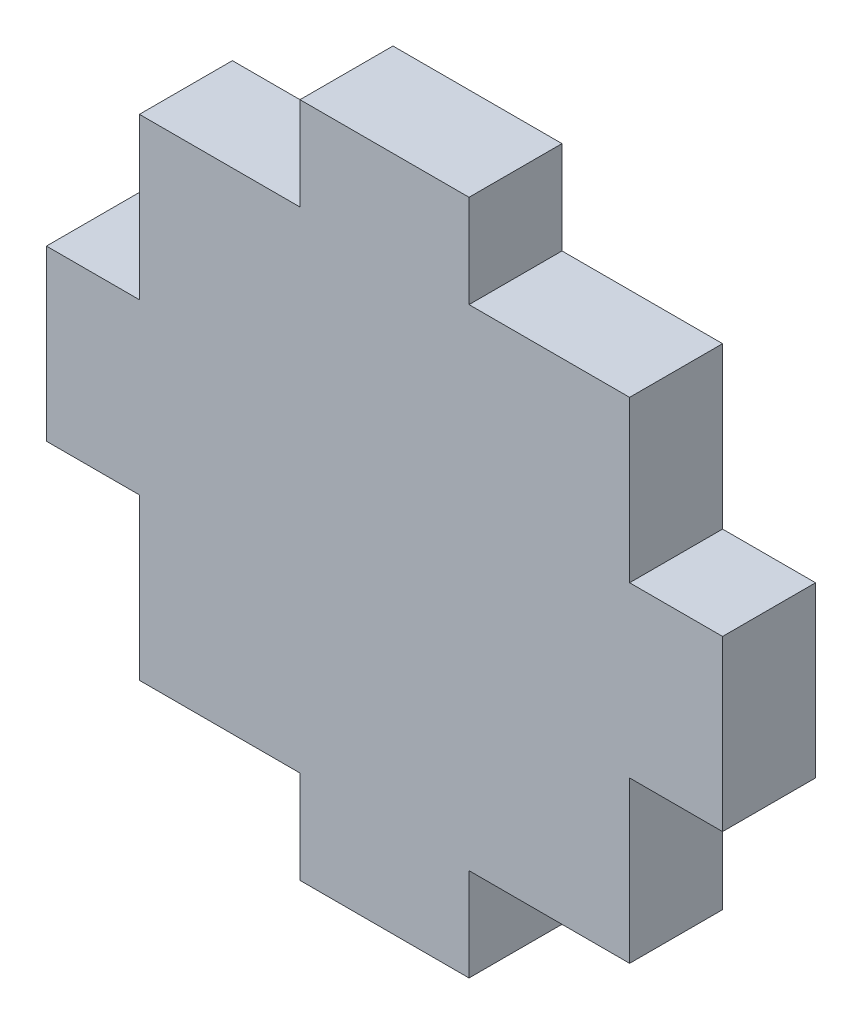
ISO-10303-21;
HEADER;
FILE_DESCRIPTION(('STEP AP214'),'2;1');
FILE_NAME('part.step','',(''),(''),'','','');
FILE_SCHEMA(('AUTOMOTIVE_DESIGN { 1 0 10303 214 1 1 1 1 }'));
ENDSEC;
DATA;
#1=APPLICATION_CONTEXT('core data for automotive mechanical design processes');
#2=APPLICATION_PROTOCOL_DEFINITION('international standard','automotive_design',2000,#1);
#3=PRODUCT_CONTEXT('',#1,'mechanical');
#4=PRODUCT('Part','Part','',(#3));
#5=PRODUCT_RELATED_PRODUCT_CATEGORY('part','',(#4));
#6=PRODUCT_DEFINITION_FORMATION('','',#4);
#7=PRODUCT_DEFINITION_CONTEXT('part definition',#1,'design');
#8=PRODUCT_DEFINITION('design','',#6,#7);
#9=PRODUCT_DEFINITION_SHAPE('','',#8);
#10=(LENGTH_UNIT() NAMED_UNIT(*) SI_UNIT(.MILLI.,.METRE.));
#11=(NAMED_UNIT(*) PLANE_ANGLE_UNIT() SI_UNIT($,.RADIAN.));
#12=(NAMED_UNIT(*) SI_UNIT($,.STERADIAN.) SOLID_ANGLE_UNIT());
#13=UNCERTAINTY_MEASURE_WITH_UNIT(LENGTH_MEASURE(1.E-05),#10,'distance_accuracy_value','');
#14=(GEOMETRIC_REPRESENTATION_CONTEXT(3) GLOBAL_UNCERTAINTY_ASSIGNED_CONTEXT((#13)) GLOBAL_UNIT_ASSIGNED_CONTEXT((#10,
#11,#12)) REPRESENTATION_CONTEXT('',''));
#15=CARTESIAN_POINT('',(0.,0.,0.));
#16=DIRECTION('',(0.,0.,1.));
#17=DIRECTION('',(1.,0.,0.));
#18=AXIS2_PLACEMENT_3D('',#15,#16,#17);
#19=CARTESIAN_POINT('',(-5.,-14.5,5.5));
#20=DIRECTION('',(0.,1.,0.));
#21=DIRECTION('',(-1.,0.,0.));
#22=AXIS2_PLACEMENT_3D('',#19,#20,#21);
#23=PLANE('',#22);
#24=DIRECTION('',(1.,0.,0.));
#25=VECTOR('',#24,1.);
#26=CARTESIAN_POINT('',(-5.,-14.5,0.));
#27=LINE('',#26,#25);
#28=CARTESIAN_POINT('',(-14.5,-14.5,0.));
#29=VERTEX_POINT('',#28);
#30=CARTESIAN_POINT('',(-5.,-14.5,0.));
#31=VERTEX_POINT('',#30);
#32=EDGE_CURVE('E201',#29,#31,#27,.T.);
#33=ORIENTED_EDGE('',*,*,#32,.T.);
#34=DIRECTION('',(0.,0.,-1.));
#35=VECTOR('',#34,1.);
#36=CARTESIAN_POINT('',(-5.,-14.5,5.5));
#37=LINE('',#36,#35);
#38=CARTESIAN_POINT('',(-5.,-14.5,5.5));
#39=VERTEX_POINT('',#38);
#40=EDGE_CURVE('E11',#39,#31,#37,.T.);
#41=ORIENTED_EDGE('',*,*,#40,.F.);
#42=DIRECTION('',(1.,0.,0.));
#43=VECTOR('',#42,1.);
#44=CARTESIAN_POINT('',(-5.,-14.5,5.5));
#45=LINE('',#44,#43);
#46=CARTESIAN_POINT('',(-14.5,-14.5,5.5));
#47=VERTEX_POINT('',#46);
#48=EDGE_CURVE('E239',#47,#39,#45,.T.);
#49=ORIENTED_EDGE('',*,*,#48,.F.);
#50=DIRECTION('',(0.,0.,-1.));
#51=VECTOR('',#50,1.);
#52=CARTESIAN_POINT('',(-14.5,-14.5,5.5));
#53=LINE('',#52,#51);
#54=EDGE_CURVE('E197',#47,#29,#53,.T.);
#55=ORIENTED_EDGE('',*,*,#54,.T.);
#56=EDGE_LOOP('',(#33,#41,#49,#55));
#57=FACE_BOUND('',#56,.T.);
#58=ADVANCED_FACE('F33',(#57),#23,.F.);
#59=CARTESIAN_POINT('',(-5.,-20.,5.5));
#60=DIRECTION('',(1.,0.,0.));
#61=DIRECTION('',(0.,1.,0.));
#62=AXIS2_PLACEMENT_3D('',#59,#60,#61);
#63=PLANE('',#62);
#64=DIRECTION('',(0.,-1.,0.));
#65=VECTOR('',#64,1.);
#66=CARTESIAN_POINT('',(-5.,-20.,0.));
#67=LINE('',#66,#65);
#68=CARTESIAN_POINT('',(-5.,-20.,0.));
#69=VERTEX_POINT('',#68);
#70=EDGE_CURVE('E204',#31,#69,#67,.T.);
#71=ORIENTED_EDGE('',*,*,#70,.T.);
#72=DIRECTION('',(0.,0.,-1.));
#73=VECTOR('',#72,1.);
#74=CARTESIAN_POINT('',(-5.,-20.,5.5));
#75=LINE('',#74,#73);
#76=CARTESIAN_POINT('',(-5.,-20.,5.5));
#77=VERTEX_POINT('',#76);
#78=EDGE_CURVE('E41',#77,#69,#75,.T.);
#79=ORIENTED_EDGE('',*,*,#78,.F.);
#80=DIRECTION('',(0.,-1.,0.));
#81=VECTOR('',#80,1.);
#82=CARTESIAN_POINT('',(-5.,-20.,5.5));
#83=LINE('',#82,#81);
#84=EDGE_CURVE('E128',#39,#77,#83,.T.);
#85=ORIENTED_EDGE('',*,*,#84,.F.);
#86=ORIENTED_EDGE('',*,*,#40,.T.);
#87=EDGE_LOOP('',(#71,#79,#85,#86));
#88=FACE_BOUND('',#87,.T.);
#89=ADVANCED_FACE('F357',(#88),#63,.F.);
#90=CARTESIAN_POINT('',(-5.,-20.,5.5));
#91=DIRECTION('',(0.,1.,0.));
#92=DIRECTION('',(0.,0.,1.));
#93=AXIS2_PLACEMENT_3D('',#90,#91,#92);
#94=PLANE('',#93);
#95=DIRECTION('',(1.,0.,0.));
#96=VECTOR('',#95,1.);
#97=CARTESIAN_POINT('',(-5.,-20.,0.));
#98=LINE('',#97,#96);
#99=CARTESIAN_POINT('',(5.,-20.,0.));
#100=VERTEX_POINT('',#99);
#101=EDGE_CURVE('E206',#69,#100,#98,.T.);
#102=ORIENTED_EDGE('',*,*,#101,.T.);
#103=DIRECTION('',(0.,0.,-1.));
#104=VECTOR('',#103,1.);
#105=CARTESIAN_POINT('',(5.,-20.,5.5));
#106=LINE('',#105,#104);
#107=CARTESIAN_POINT('',(5.,-20.,5.5));
#108=VERTEX_POINT('',#107);
#109=EDGE_CURVE('E282',#108,#100,#106,.T.);
#110=ORIENTED_EDGE('',*,*,#109,.F.);
#111=DIRECTION('',(1.,0.,0.));
#112=VECTOR('',#111,1.);
#113=CARTESIAN_POINT('',(-5.,-20.,5.5));
#114=LINE('',#113,#112);
#115=EDGE_CURVE('E290',#77,#108,#114,.T.);
#116=ORIENTED_EDGE('',*,*,#115,.F.);
#117=ORIENTED_EDGE('',*,*,#78,.T.);
#118=EDGE_LOOP('',(#102,#110,#116,#117));
#119=FACE_BOUND('',#118,.T.);
#120=ADVANCED_FACE('F288',(#119),#94,.F.);
#121=CARTESIAN_POINT('',(5.,-20.,5.5));
#122=DIRECTION('',(-1.,0.,0.));
#123=DIRECTION('',(0.,-1.,0.));
#124=AXIS2_PLACEMENT_3D('',#121,#122,#123);
#125=PLANE('',#124);
#126=DIRECTION('',(0.,1.,0.));
#127=VECTOR('',#126,1.);
#128=CARTESIAN_POINT('',(5.,-20.,0.));
#129=LINE('',#128,#127);
#130=CARTESIAN_POINT('',(5.,-14.5,0.));
#131=VERTEX_POINT('',#130);
#132=EDGE_CURVE('E208',#100,#131,#129,.T.);
#133=ORIENTED_EDGE('',*,*,#132,.T.);
#134=DIRECTION('',(0.,0.,-1.));
#135=VECTOR('',#134,1.);
#136=CARTESIAN_POINT('',(5.,-14.5,5.5));
#137=LINE('',#136,#135);
#138=CARTESIAN_POINT('',(5.,-14.5,5.5));
#139=VERTEX_POINT('',#138);
#140=EDGE_CURVE('E279',#139,#131,#137,.T.);
#141=ORIENTED_EDGE('',*,*,#140,.F.);
#142=DIRECTION('',(0.,1.,0.));
#143=VECTOR('',#142,1.);
#144=CARTESIAN_POINT('',(5.,-20.,5.5));
#145=LINE('',#144,#143);
#146=EDGE_CURVE('E308',#108,#139,#145,.T.);
#147=ORIENTED_EDGE('',*,*,#146,.F.);
#148=ORIENTED_EDGE('',*,*,#109,.T.);
#149=EDGE_LOOP('',(#133,#141,#147,#148));
#150=FACE_BOUND('',#149,.T.);
#151=ADVANCED_FACE('F299',(#150),#125,.F.);
#152=CARTESIAN_POINT('',(14.5,-14.5,5.5));
#153=DIRECTION('',(0.,1.,0.));
#154=DIRECTION('',(-1.,0.,0.));
#155=AXIS2_PLACEMENT_3D('',#152,#153,#154);
#156=PLANE('',#155);
#157=DIRECTION('',(1.,0.,0.));
#158=VECTOR('',#157,1.);
#159=CARTESIAN_POINT('',(14.5,-14.5,0.));
#160=LINE('',#159,#158);
#161=CARTESIAN_POINT('',(14.5,-14.5,0.));
#162=VERTEX_POINT('',#161);
#163=EDGE_CURVE('E210',#131,#162,#160,.T.);
#164=ORIENTED_EDGE('',*,*,#163,.T.);
#165=DIRECTION('',(0.,0.,-1.));
#166=VECTOR('',#165,1.);
#167=CARTESIAN_POINT('',(14.5,-14.5,5.5));
#168=LINE('',#167,#166);
#169=CARTESIAN_POINT('',(14.5,-14.5,5.5));
#170=VERTEX_POINT('',#169);
#171=EDGE_CURVE('E276',#170,#162,#168,.T.);
#172=ORIENTED_EDGE('',*,*,#171,.F.);
#173=DIRECTION('',(1.,0.,0.));
#174=VECTOR('',#173,1.);
#175=CARTESIAN_POINT('',(14.5,-14.5,5.5));
#176=LINE('',#175,#174);
#177=EDGE_CURVE('E305',#139,#170,#176,.T.);
#178=ORIENTED_EDGE('',*,*,#177,.F.);
#179=ORIENTED_EDGE('',*,*,#140,.T.);
#180=EDGE_LOOP('',(#164,#172,#178,#179));
#181=FACE_BOUND('',#180,.T.);
#182=ADVANCED_FACE('F303',(#181),#156,.F.);
#183=CARTESIAN_POINT('',(14.5,-5.,5.5));
#184=DIRECTION('',(-1.,0.,0.));
#185=DIRECTION('',(0.,-1.,0.));
#186=AXIS2_PLACEMENT_3D('',#183,#184,#185);
#187=PLANE('',#186);
#188=DIRECTION('',(0.,1.,0.));
#189=VECTOR('',#188,1.);
#190=CARTESIAN_POINT('',(14.5,-5.,0.));
#191=LINE('',#190,#189);
#192=CARTESIAN_POINT('',(14.5,-5.,0.));
#193=VERTEX_POINT('',#192);
#194=EDGE_CURVE('E212',#162,#193,#191,.T.);
#195=ORIENTED_EDGE('',*,*,#194,.T.);
#196=DIRECTION('',(0.,0.,-1.));
#197=VECTOR('',#196,1.);
#198=CARTESIAN_POINT('',(14.5,-5.,5.5));
#199=LINE('',#198,#197);
#200=CARTESIAN_POINT('',(14.5,-5.,5.5));
#201=VERTEX_POINT('',#200);
#202=EDGE_CURVE('E273',#201,#193,#199,.T.);
#203=ORIENTED_EDGE('',*,*,#202,.F.);
#204=DIRECTION('',(0.,1.,0.));
#205=VECTOR('',#204,1.);
#206=CARTESIAN_POINT('',(14.5,-5.,5.5));
#207=LINE('',#206,#205);
#208=EDGE_CURVE('E307',#170,#201,#207,.T.);
#209=ORIENTED_EDGE('',*,*,#208,.F.);
#210=ORIENTED_EDGE('',*,*,#171,.T.);
#211=EDGE_LOOP('',(#195,#203,#209,#210));
#212=FACE_BOUND('',#211,.T.);
#213=ADVANCED_FACE('F370',(#212),#187,.F.);
#214=CARTESIAN_POINT('',(20.,-5.00000000000001,5.5));
#215=DIRECTION('',(0.,1.,0.));
#216=DIRECTION('',(-1.,0.,0.));
#217=AXIS2_PLACEMENT_3D('',#214,#215,#216);
#218=PLANE('',#217);
#219=DIRECTION('',(1.,0.,0.));
#220=VECTOR('',#219,1.);
#221=CARTESIAN_POINT('',(20.,-5.00000000000001,0.));
#222=LINE('',#221,#220);
#223=CARTESIAN_POINT('',(20.,-5.00000000000001,0.));
#224=VERTEX_POINT('',#223);
#225=EDGE_CURVE('E214',#193,#224,#222,.T.);
#226=ORIENTED_EDGE('',*,*,#225,.T.);
#227=DIRECTION('',(0.,0.,-1.));
#228=VECTOR('',#227,1.);
#229=CARTESIAN_POINT('',(20.,-5.00000000000001,5.5));
#230=LINE('',#229,#228);
#231=CARTESIAN_POINT('',(20.,-5.00000000000001,5.5));
#232=VERTEX_POINT('',#231);
#233=EDGE_CURVE('E270',#232,#224,#230,.T.);
#234=ORIENTED_EDGE('',*,*,#233,.F.);
#235=DIRECTION('',(1.,0.,0.));
#236=VECTOR('',#235,1.);
#237=CARTESIAN_POINT('',(20.,-5.00000000000001,5.5));
#238=LINE('',#237,#236);
#239=EDGE_CURVE('E310',#201,#232,#238,.T.);
#240=ORIENTED_EDGE('',*,*,#239,.F.);
#241=ORIENTED_EDGE('',*,*,#202,.T.);
#242=EDGE_LOOP('',(#226,#234,#240,#241));
#243=FACE_BOUND('',#242,.T.);
#244=ADVANCED_FACE('F373',(#243),#218,.F.);
#245=CARTESIAN_POINT('',(20.,4.99999999999999,5.5));
#246=DIRECTION('',(-1.,0.,0.));
#247=DIRECTION('',(0.,0.,1.));
#248=AXIS2_PLACEMENT_3D('',#245,#246,#247);
#249=PLANE('',#248);
#250=DIRECTION('',(0.,1.,0.));
#251=VECTOR('',#250,1.);
#252=CARTESIAN_POINT('',(20.,4.99999999999999,0.));
#253=LINE('',#252,#251);
#254=CARTESIAN_POINT('',(20.,4.99999999999999,0.));
#255=VERTEX_POINT('',#254);
#256=EDGE_CURVE('E216',#224,#255,#253,.T.);
#257=ORIENTED_EDGE('',*,*,#256,.T.);
#258=DIRECTION('',(0.,0.,-1.));
#259=VECTOR('',#258,1.);
#260=CARTESIAN_POINT('',(20.,4.99999999999999,5.5));
#261=LINE('',#260,#259);
#262=CARTESIAN_POINT('',(20.,4.99999999999999,5.5));
#263=VERTEX_POINT('',#262);
#264=EDGE_CURVE('E267',#263,#255,#261,.T.);
#265=ORIENTED_EDGE('',*,*,#264,.F.);
#266=DIRECTION('',(0.,1.,0.));
#267=VECTOR('',#266,1.);
#268=CARTESIAN_POINT('',(20.,4.99999999999999,5.5));
#269=LINE('',#268,#267);
#270=EDGE_CURVE('E316',#232,#263,#269,.T.);
#271=ORIENTED_EDGE('',*,*,#270,.F.);
#272=ORIENTED_EDGE('',*,*,#233,.T.);
#273=EDGE_LOOP('',(#257,#265,#271,#272));
#274=FACE_BOUND('',#273,.T.);
#275=ADVANCED_FACE('F377',(#274),#249,.F.);
#276=CARTESIAN_POINT('',(20.,4.99999999999999,5.5));
#277=DIRECTION('',(0.,-1.,0.));
#278=DIRECTION('',(1.,0.,0.));
#279=AXIS2_PLACEMENT_3D('',#276,#277,#278);
#280=PLANE('',#279);
#281=DIRECTION('',(-1.,0.,0.));
#282=VECTOR('',#281,1.);
#283=CARTESIAN_POINT('',(20.,4.99999999999999,0.));
#284=LINE('',#283,#282);
#285=CARTESIAN_POINT('',(14.5,5.,0.));
#286=VERTEX_POINT('',#285);
#287=EDGE_CURVE('E218',#255,#286,#284,.T.);
#288=ORIENTED_EDGE('',*,*,#287,.T.);
#289=DIRECTION('',(0.,0.,-1.));
#290=VECTOR('',#289,1.);
#291=CARTESIAN_POINT('',(14.5,5.,5.5));
#292=LINE('',#291,#290);
#293=CARTESIAN_POINT('',(14.5,5.,5.5));
#294=VERTEX_POINT('',#293);
#295=EDGE_CURVE('E264',#294,#286,#292,.T.);
#296=ORIENTED_EDGE('',*,*,#295,.F.);
#297=DIRECTION('',(-1.,0.,0.));
#298=VECTOR('',#297,1.);
#299=CARTESIAN_POINT('',(20.,4.99999999999999,5.5));
#300=LINE('',#299,#298);
#301=EDGE_CURVE('E318',#263,#294,#300,.T.);
#302=ORIENTED_EDGE('',*,*,#301,.F.);
#303=ORIENTED_EDGE('',*,*,#264,.T.);
#304=EDGE_LOOP('',(#288,#296,#302,#303));
#305=FACE_BOUND('',#304,.T.);
#306=ADVANCED_FACE('F381',(#305),#280,.F.);
#307=CARTESIAN_POINT('',(14.5,14.5,5.5));
#308=DIRECTION('',(-1.,0.,0.));
#309=DIRECTION('',(0.,-1.,0.));
#310=AXIS2_PLACEMENT_3D('',#307,#308,#309);
#311=PLANE('',#310);
#312=DIRECTION('',(0.,1.,0.));
#313=VECTOR('',#312,1.);
#314=CARTESIAN_POINT('',(14.5,14.5,0.));
#315=LINE('',#314,#313);
#316=CARTESIAN_POINT('',(14.5,14.5,0.));
#317=VERTEX_POINT('',#316);
#318=EDGE_CURVE('E220',#286,#317,#315,.T.);
#319=ORIENTED_EDGE('',*,*,#318,.T.);
#320=DIRECTION('',(0.,0.,-1.));
#321=VECTOR('',#320,1.);
#322=CARTESIAN_POINT('',(14.5,14.5,5.5));
#323=LINE('',#322,#321);
#324=CARTESIAN_POINT('',(14.5,14.5,5.5));
#325=VERTEX_POINT('',#324);
#326=EDGE_CURVE('E261',#325,#317,#323,.T.);
#327=ORIENTED_EDGE('',*,*,#326,.F.);
#328=DIRECTION('',(0.,1.,0.));
#329=VECTOR('',#328,1.);
#330=CARTESIAN_POINT('',(14.5,14.5,5.5));
#331=LINE('',#330,#329);
#332=EDGE_CURVE('E320',#294,#325,#331,.T.);
#333=ORIENTED_EDGE('',*,*,#332,.F.);
#334=ORIENTED_EDGE('',*,*,#295,.T.);
#335=EDGE_LOOP('',(#319,#327,#333,#334));
#336=FACE_BOUND('',#335,.T.);
#337=ADVANCED_FACE('F385',(#336),#311,.F.);
#338=CARTESIAN_POINT('',(14.5,14.5,5.5));
#339=DIRECTION('',(0.,-1.,0.));
#340=DIRECTION('',(1.,0.,0.));
#341=AXIS2_PLACEMENT_3D('',#338,#339,#340);
#342=PLANE('',#341);
#343=DIRECTION('',(-1.,0.,0.));
#344=VECTOR('',#343,1.);
#345=CARTESIAN_POINT('',(14.5,14.5,0.));
#346=LINE('',#345,#344);
#347=CARTESIAN_POINT('',(5.,14.5,0.));
#348=VERTEX_POINT('',#347);
#349=EDGE_CURVE('E222',#317,#348,#346,.T.);
#350=ORIENTED_EDGE('',*,*,#349,.T.);
#351=DIRECTION('',(0.,0.,-1.));
#352=VECTOR('',#351,1.);
#353=CARTESIAN_POINT('',(5.,14.5,5.5));
#354=LINE('',#353,#352);
#355=CARTESIAN_POINT('',(5.,14.5,5.5));
#356=VERTEX_POINT('',#355);
#357=EDGE_CURVE('E258',#356,#348,#354,.T.);
#358=ORIENTED_EDGE('',*,*,#357,.F.);
#359=DIRECTION('',(-1.,0.,0.));
#360=VECTOR('',#359,1.);
#361=CARTESIAN_POINT('',(14.5,14.5,5.5));
#362=LINE('',#361,#360);
#363=EDGE_CURVE('E322',#325,#356,#362,.T.);
#364=ORIENTED_EDGE('',*,*,#363,.F.);
#365=ORIENTED_EDGE('',*,*,#326,.T.);
#366=EDGE_LOOP('',(#350,#358,#364,#365));
#367=FACE_BOUND('',#366,.T.);
#368=ADVANCED_FACE('F389',(#367),#342,.F.);
#369=CARTESIAN_POINT('',(5.,20.,5.5));
#370=DIRECTION('',(-1.,0.,0.));
#371=DIRECTION('',(0.,-1.,0.));
#372=AXIS2_PLACEMENT_3D('',#369,#370,#371);
#373=PLANE('',#372);
#374=DIRECTION('',(0.,1.,0.));
#375=VECTOR('',#374,1.);
#376=CARTESIAN_POINT('',(5.,20.,0.));
#377=LINE('',#376,#375);
#378=CARTESIAN_POINT('',(5.,20.,0.));
#379=VERTEX_POINT('',#378);
#380=EDGE_CURVE('E224',#348,#379,#377,.T.);
#381=ORIENTED_EDGE('',*,*,#380,.T.);
#382=DIRECTION('',(0.,0.,-1.));
#383=VECTOR('',#382,1.);
#384=CARTESIAN_POINT('',(5.,20.,5.5));
#385=LINE('',#384,#383);
#386=CARTESIAN_POINT('',(5.,20.,5.5));
#387=VERTEX_POINT('',#386);
#388=EDGE_CURVE('E255',#387,#379,#385,.T.);
#389=ORIENTED_EDGE('',*,*,#388,.F.);
#390=DIRECTION('',(0.,1.,0.));
#391=VECTOR('',#390,1.);
#392=CARTESIAN_POINT('',(5.,20.,5.5));
#393=LINE('',#392,#391);
#394=EDGE_CURVE('E324',#356,#387,#393,.T.);
#395=ORIENTED_EDGE('',*,*,#394,.F.);
#396=ORIENTED_EDGE('',*,*,#357,.T.);
#397=EDGE_LOOP('',(#381,#389,#395,#396));
#398=FACE_BOUND('',#397,.T.);
#399=ADVANCED_FACE('F393',(#398),#373,.F.);
#400=CARTESIAN_POINT('',(-5.,20.,5.5));
#401=DIRECTION('',(0.,-1.,0.));
#402=DIRECTION('',(0.,0.,-1.));
#403=AXIS2_PLACEMENT_3D('',#400,#401,#402);
#404=PLANE('',#403);
#405=DIRECTION('',(-1.,0.,0.));
#406=VECTOR('',#405,1.);
#407=CARTESIAN_POINT('',(-5.,20.,0.));
#408=LINE('',#407,#406);
#409=CARTESIAN_POINT('',(-5.,20.,0.));
#410=VERTEX_POINT('',#409);
#411=EDGE_CURVE('E226',#379,#410,#408,.T.);
#412=ORIENTED_EDGE('',*,*,#411,.T.);
#413=DIRECTION('',(0.,0.,-1.));
#414=VECTOR('',#413,1.);
#415=CARTESIAN_POINT('',(-5.,20.,5.5));
#416=LINE('',#415,#414);
#417=CARTESIAN_POINT('',(-5.,20.,5.5));
#418=VERTEX_POINT('',#417);
#419=EDGE_CURVE('E252',#418,#410,#416,.T.);
#420=ORIENTED_EDGE('',*,*,#419,.F.);
#421=DIRECTION('',(-1.,0.,0.));
#422=VECTOR('',#421,1.);
#423=CARTESIAN_POINT('',(-5.,20.,5.5));
#424=LINE('',#423,#422);
#425=EDGE_CURVE('E326',#387,#418,#424,.T.);
#426=ORIENTED_EDGE('',*,*,#425,.F.);
#427=ORIENTED_EDGE('',*,*,#388,.T.);
#428=EDGE_LOOP('',(#412,#420,#426,#427));
#429=FACE_BOUND('',#428,.T.);
#430=ADVANCED_FACE('F397',(#429),#404,.F.);
#431=CARTESIAN_POINT('',(-5.,20.,5.5));
#432=DIRECTION('',(1.,0.,0.));
#433=DIRECTION('',(0.,1.,0.));
#434=AXIS2_PLACEMENT_3D('',#431,#432,#433);
#435=PLANE('',#434);
#436=DIRECTION('',(0.,-1.,0.));
#437=VECTOR('',#436,1.);
#438=CARTESIAN_POINT('',(-5.,20.,0.));
#439=LINE('',#438,#437);
#440=CARTESIAN_POINT('',(-5.,14.5,0.));
#441=VERTEX_POINT('',#440);
#442=EDGE_CURVE('E228',#410,#441,#439,.T.);
#443=ORIENTED_EDGE('',*,*,#442,.T.);
#444=DIRECTION('',(0.,0.,-1.));
#445=VECTOR('',#444,1.);
#446=CARTESIAN_POINT('',(-5.,14.5,5.5));
#447=LINE('',#446,#445);
#448=CARTESIAN_POINT('',(-5.,14.5,5.5));
#449=VERTEX_POINT('',#448);
#450=EDGE_CURVE('E249',#449,#441,#447,.T.);
#451=ORIENTED_EDGE('',*,*,#450,.F.);
#452=DIRECTION('',(0.,-1.,0.));
#453=VECTOR('',#452,1.);
#454=CARTESIAN_POINT('',(-5.,20.,5.5));
#455=LINE('',#454,#453);
#456=EDGE_CURVE('E328',#418,#449,#455,.T.);
#457=ORIENTED_EDGE('',*,*,#456,.F.);
#458=ORIENTED_EDGE('',*,*,#419,.T.);
#459=EDGE_LOOP('',(#443,#451,#457,#458));
#460=FACE_BOUND('',#459,.T.);
#461=ADVANCED_FACE('F401',(#460),#435,.F.);
#462=CARTESIAN_POINT('',(-5.,14.5,5.5));
#463=DIRECTION('',(0.,-1.,0.));
#464=DIRECTION('',(0.,0.,-1.));
#465=AXIS2_PLACEMENT_3D('',#462,#463,#464);
#466=PLANE('',#465);
#467=DIRECTION('',(-1.,0.,0.));
#468=VECTOR('',#467,1.);
#469=CARTESIAN_POINT('',(-5.,14.5,0.));
#470=LINE('',#469,#468);
#471=CARTESIAN_POINT('',(-14.5,14.5,0.));
#472=VERTEX_POINT('',#471);
#473=EDGE_CURVE('E230',#441,#472,#470,.T.);
#474=ORIENTED_EDGE('',*,*,#473,.T.);
#475=DIRECTION('',(0.,0.,-1.));
#476=VECTOR('',#475,1.);
#477=CARTESIAN_POINT('',(-14.5,14.5,5.5));
#478=LINE('',#477,#476);
#479=CARTESIAN_POINT('',(-14.5,14.5,5.5));
#480=VERTEX_POINT('',#479);
#481=EDGE_CURVE('E246',#480,#472,#478,.T.);
#482=ORIENTED_EDGE('',*,*,#481,.F.);
#483=DIRECTION('',(-1.,0.,0.));
#484=VECTOR('',#483,1.);
#485=CARTESIAN_POINT('',(-5.,14.5,5.5));
#486=LINE('',#485,#484);
#487=EDGE_CURVE('E330',#449,#480,#486,.T.);
#488=ORIENTED_EDGE('',*,*,#487,.F.);
#489=ORIENTED_EDGE('',*,*,#450,.T.);
#490=EDGE_LOOP('',(#474,#482,#488,#489));
#491=FACE_BOUND('',#490,.T.);
#492=ADVANCED_FACE('F405',(#491),#466,.F.);
#493=CARTESIAN_POINT('',(-14.5,14.5,5.5));
#494=DIRECTION('',(1.,0.,0.));
#495=DIRECTION('',(0.,1.,0.));
#496=AXIS2_PLACEMENT_3D('',#493,#494,#495);
#497=PLANE('',#496);
#498=DIRECTION('',(0.,-1.,0.));
#499=VECTOR('',#498,1.);
#500=CARTESIAN_POINT('',(-14.5,14.5,0.));
#501=LINE('',#500,#499);
#502=CARTESIAN_POINT('',(-14.5,5.,0.));
#503=VERTEX_POINT('',#502);
#504=EDGE_CURVE('E232',#472,#503,#501,.T.);
#505=ORIENTED_EDGE('',*,*,#504,.T.);
#506=DIRECTION('',(0.,0.,-1.));
#507=VECTOR('',#506,1.);
#508=CARTESIAN_POINT('',(-14.5,5.,5.5));
#509=LINE('',#508,#507);
#510=CARTESIAN_POINT('',(-14.5,5.,5.5));
#511=VERTEX_POINT('',#510);
#512=EDGE_CURVE('E243',#511,#503,#509,.T.);
#513=ORIENTED_EDGE('',*,*,#512,.F.);
#514=DIRECTION('',(0.,-1.,0.));
#515=VECTOR('',#514,1.);
#516=CARTESIAN_POINT('',(-14.5,14.5,5.5));
#517=LINE('',#516,#515);
#518=EDGE_CURVE('E332',#480,#511,#517,.T.);
#519=ORIENTED_EDGE('',*,*,#518,.F.);
#520=ORIENTED_EDGE('',*,*,#481,.T.);
#521=EDGE_LOOP('',(#505,#513,#519,#520));
#522=FACE_BOUND('',#521,.T.);
#523=ADVANCED_FACE('F338',(#522),#497,.F.);
#524=CARTESIAN_POINT('',(-20.,5.,5.5));
#525=DIRECTION('',(0.,-1.,0.));
#526=DIRECTION('',(0.,0.,-1.));
#527=AXIS2_PLACEMENT_3D('',#524,#525,#526);
#528=PLANE('',#527);
#529=DIRECTION('',(-1.,0.,0.));
#530=VECTOR('',#529,1.);
#531=CARTESIAN_POINT('',(-20.,5.,0.));
#532=LINE('',#531,#530);
#533=CARTESIAN_POINT('',(-20.,5.,0.));
#534=VERTEX_POINT('',#533);
#535=EDGE_CURVE('E234',#503,#534,#532,.T.);
#536=ORIENTED_EDGE('',*,*,#535,.T.);
#537=DIRECTION('',(0.,0.,-1.));
#538=VECTOR('',#537,1.);
#539=CARTESIAN_POINT('',(-20.,5.,5.5));
#540=LINE('',#539,#538);
#541=CARTESIAN_POINT('',(-20.,5.,5.5));
#542=VERTEX_POINT('',#541);
#543=EDGE_CURVE('E192',#542,#534,#540,.T.);
#544=ORIENTED_EDGE('',*,*,#543,.F.);
#545=DIRECTION('',(-1.,0.,0.));
#546=VECTOR('',#545,1.);
#547=CARTESIAN_POINT('',(-20.,5.,5.5));
#548=LINE('',#547,#546);
#549=EDGE_CURVE('E183',#511,#542,#548,.T.);
#550=ORIENTED_EDGE('',*,*,#549,.F.);
#551=ORIENTED_EDGE('',*,*,#512,.T.);
#552=EDGE_LOOP('',(#536,#544,#550,#551));
#553=FACE_BOUND('',#552,.T.);
#554=ADVANCED_FACE('F342',(#553),#528,.F.);
#555=CARTESIAN_POINT('',(-20.,5.,5.5));
#556=DIRECTION('',(1.,0.,0.));
#557=DIRECTION('',(0.,0.,-1.));
#558=AXIS2_PLACEMENT_3D('',#555,#556,#557);
#559=PLANE('',#558);
#560=DIRECTION('',(0.,-1.,0.));
#561=VECTOR('',#560,1.);
#562=CARTESIAN_POINT('',(-20.,5.,0.));
#563=LINE('',#562,#561);
#564=CARTESIAN_POINT('',(-20.,-5.,0.));
#565=VERTEX_POINT('',#564);
#566=EDGE_CURVE('E191',#534,#565,#563,.T.);
#567=ORIENTED_EDGE('',*,*,#566,.T.);
#568=DIRECTION('',(0.,0.,-1.));
#569=VECTOR('',#568,1.);
#570=CARTESIAN_POINT('',(-20.,-5.,5.5));
#571=LINE('',#570,#569);
#572=CARTESIAN_POINT('',(-20.,-5.,5.5));
#573=VERTEX_POINT('',#572);
#574=EDGE_CURVE('E188',#573,#565,#571,.T.);
#575=ORIENTED_EDGE('',*,*,#574,.F.);
#576=DIRECTION('',(0.,-1.,0.));
#577=VECTOR('',#576,1.);
#578=CARTESIAN_POINT('',(-20.,5.,5.5));
#579=LINE('',#578,#577);
#580=EDGE_CURVE('E177',#542,#573,#579,.T.);
#581=ORIENTED_EDGE('',*,*,#580,.F.);
#582=ORIENTED_EDGE('',*,*,#543,.T.);
#583=EDGE_LOOP('',(#567,#575,#581,#582));
#584=FACE_BOUND('',#583,.T.);
#585=ADVANCED_FACE('F189',(#584),#559,.F.);
#586=CARTESIAN_POINT('',(-20.,-5.,5.5));
#587=DIRECTION('',(0.,1.,0.));
#588=DIRECTION('',(0.,0.,1.));
#589=AXIS2_PLACEMENT_3D('',#586,#587,#588);
#590=PLANE('',#589);
#591=DIRECTION('',(1.,0.,0.));
#592=VECTOR('',#591,1.);
#593=CARTESIAN_POINT('',(-20.,-5.,0.));
#594=LINE('',#593,#592);
#595=CARTESIAN_POINT('',(-14.5,-5.,0.));
#596=VERTEX_POINT('',#595);
#597=EDGE_CURVE('E114',#565,#596,#594,.T.);
#598=ORIENTED_EDGE('',*,*,#597,.T.);
#599=DIRECTION('',(0.,0.,-1.));
#600=VECTOR('',#599,1.);
#601=CARTESIAN_POINT('',(-14.5,-5.,5.5));
#602=LINE('',#601,#600);
#603=CARTESIAN_POINT('',(-14.5,-5.,5.5));
#604=VERTEX_POINT('',#603);
#605=EDGE_CURVE('E193',#604,#596,#602,.T.);
#606=ORIENTED_EDGE('',*,*,#605,.F.);
#607=DIRECTION('',(1.,0.,0.));
#608=VECTOR('',#607,1.);
#609=CARTESIAN_POINT('',(-20.,-5.,5.5));
#610=LINE('',#609,#608);
#611=EDGE_CURVE('E181',#573,#604,#610,.T.);
#612=ORIENTED_EDGE('',*,*,#611,.F.);
#613=ORIENTED_EDGE('',*,*,#574,.T.);
#614=EDGE_LOOP('',(#598,#606,#612,#613));
#615=FACE_BOUND('',#614,.T.);
#616=ADVANCED_FACE('F195',(#615),#590,.F.);
#617=CARTESIAN_POINT('',(-14.5,-5.,5.5));
#618=DIRECTION('',(1.,0.,0.));
#619=DIRECTION('',(0.,0.,-1.));
#620=AXIS2_PLACEMENT_3D('',#617,#618,#619);
#621=PLANE('',#620);
#622=DIRECTION('',(0.,-1.,0.));
#623=VECTOR('',#622,1.);
#624=CARTESIAN_POINT('',(-14.5,-5.,0.));
#625=LINE('',#624,#623);
#626=EDGE_CURVE('E120',#596,#29,#625,.T.);
#627=ORIENTED_EDGE('',*,*,#626,.T.);
#628=ORIENTED_EDGE('',*,*,#54,.F.);
#629=DIRECTION('',(0.,-1.,0.));
#630=VECTOR('',#629,1.);
#631=CARTESIAN_POINT('',(-14.5,-5.,5.5));
#632=LINE('',#631,#630);
#633=EDGE_CURVE('E49',#604,#47,#632,.T.);
#634=ORIENTED_EDGE('',*,*,#633,.F.);
#635=ORIENTED_EDGE('',*,*,#605,.T.);
#636=EDGE_LOOP('',(#627,#628,#634,#635));
#637=FACE_BOUND('',#636,.T.);
#638=ADVANCED_FACE('F346',(#637),#621,.F.);
#639=CARTESIAN_POINT('',(0.,0.,5.5));
#640=DIRECTION('',(0.,0.,1.));
#641=DIRECTION('',(1.,0.,0.));
#642=AXIS2_PLACEMENT_3D('',#639,#640,#641);
#643=PLANE('',#642);
#644=ORIENTED_EDGE('',*,*,#48,.T.);
#645=ORIENTED_EDGE('',*,*,#84,.T.);
#646=ORIENTED_EDGE('',*,*,#115,.T.);
#647=ORIENTED_EDGE('',*,*,#146,.T.);
#648=ORIENTED_EDGE('',*,*,#177,.T.);
#649=ORIENTED_EDGE('',*,*,#208,.T.);
#650=ORIENTED_EDGE('',*,*,#239,.T.);
#651=ORIENTED_EDGE('',*,*,#270,.T.);
#652=ORIENTED_EDGE('',*,*,#301,.T.);
#653=ORIENTED_EDGE('',*,*,#332,.T.);
#654=ORIENTED_EDGE('',*,*,#363,.T.);
#655=ORIENTED_EDGE('',*,*,#394,.T.);
#656=ORIENTED_EDGE('',*,*,#425,.T.);
#657=ORIENTED_EDGE('',*,*,#456,.T.);
#658=ORIENTED_EDGE('',*,*,#487,.T.);
#659=ORIENTED_EDGE('',*,*,#518,.T.);
#660=ORIENTED_EDGE('',*,*,#549,.T.);
#661=ORIENTED_EDGE('',*,*,#580,.T.);
#662=ORIENTED_EDGE('',*,*,#611,.T.);
#663=ORIENTED_EDGE('',*,*,#633,.T.);
#664=EDGE_LOOP('',(#644,#645,#646,#647,#648,#649,#650,#651,#652,#653,#654,#655,#656,#657,#658,
#659,#660,#661,#662,#663));
#665=FACE_BOUND('',#664,.T.);
#666=ADVANCED_FACE('F179',(#665),#643,.T.);
#667=CARTESIAN_POINT('',(0.,0.,0.));
#668=DIRECTION('',(0.,0.,1.));
#669=DIRECTION('',(1.,0.,0.));
#670=AXIS2_PLACEMENT_3D('',#667,#668,#669);
#671=PLANE('',#670);
#672=ORIENTED_EDGE('',*,*,#32,.F.);
#673=ORIENTED_EDGE('',*,*,#626,.F.);
#674=ORIENTED_EDGE('',*,*,#597,.F.);
#675=ORIENTED_EDGE('',*,*,#566,.F.);
#676=ORIENTED_EDGE('',*,*,#535,.F.);
#677=ORIENTED_EDGE('',*,*,#504,.F.);
#678=ORIENTED_EDGE('',*,*,#473,.F.);
#679=ORIENTED_EDGE('',*,*,#442,.F.);
#680=ORIENTED_EDGE('',*,*,#411,.F.);
#681=ORIENTED_EDGE('',*,*,#380,.F.);
#682=ORIENTED_EDGE('',*,*,#349,.F.);
#683=ORIENTED_EDGE('',*,*,#318,.F.);
#684=ORIENTED_EDGE('',*,*,#287,.F.);
#685=ORIENTED_EDGE('',*,*,#256,.F.);
#686=ORIENTED_EDGE('',*,*,#225,.F.);
#687=ORIENTED_EDGE('',*,*,#194,.F.);
#688=ORIENTED_EDGE('',*,*,#163,.F.);
#689=ORIENTED_EDGE('',*,*,#132,.F.);
#690=ORIENTED_EDGE('',*,*,#101,.F.);
#691=ORIENTED_EDGE('',*,*,#70,.F.);
#692=EDGE_LOOP('',(#672,#673,#674,#675,#676,#677,#678,#679,#680,#681,#682,#683,#684,#685,#686,
#687,#688,#689,#690,#691));
#693=FACE_BOUND('',#692,.T.);
#694=ADVANCED_FACE('F294',(#693),#671,.F.);
#695=CLOSED_SHELL('',(#58,#89,#120,#151,#182,#213,#244,#275,#306,#337,#368,#399,#430,#461,#492,
#523,#554,#585,#616,#638,#666,#694));
#696=MANIFOLD_SOLID_BREP('B2',#695);
#697=ADVANCED_BREP_SHAPE_REPRESENTATION('',(#18,#696),#14);
#698=SHAPE_DEFINITION_REPRESENTATION(#9,#697);
ENDSEC;
END-ISO-10303-21;
